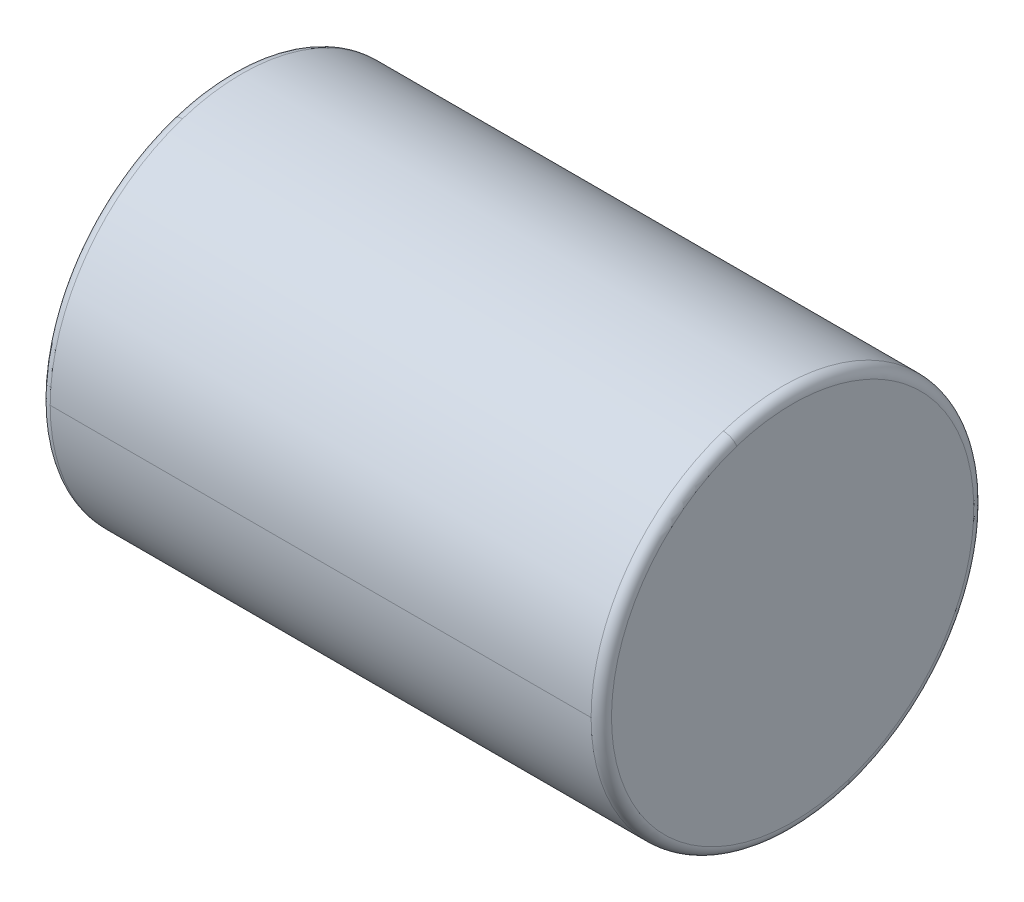
ISO-10303-21;
HEADER;
FILE_DESCRIPTION(('STEP AP214'),'2;1');
FILE_NAME('part.step','',(''),(''),'','','');
FILE_SCHEMA(('AUTOMOTIVE_DESIGN { 1 0 10303 214 1 1 1 1 }'));
ENDSEC;
DATA;
#1=APPLICATION_CONTEXT('core data for automotive mechanical design processes');
#2=APPLICATION_PROTOCOL_DEFINITION('international standard','automotive_design',2000,#1);
#3=PRODUCT_CONTEXT('',#1,'mechanical');
#4=PRODUCT('Part','Part','',(#3));
#5=PRODUCT_RELATED_PRODUCT_CATEGORY('part','',(#4));
#6=PRODUCT_DEFINITION_FORMATION('','',#4);
#7=PRODUCT_DEFINITION_CONTEXT('part definition',#1,'design');
#8=PRODUCT_DEFINITION('design','',#6,#7);
#9=PRODUCT_DEFINITION_SHAPE('','',#8);
#10=(LENGTH_UNIT() NAMED_UNIT(*) SI_UNIT(.MILLI.,.METRE.));
#11=(NAMED_UNIT(*) PLANE_ANGLE_UNIT() SI_UNIT($,.RADIAN.));
#12=(NAMED_UNIT(*) SI_UNIT($,.STERADIAN.) SOLID_ANGLE_UNIT());
#13=UNCERTAINTY_MEASURE_WITH_UNIT(LENGTH_MEASURE(1.E-05),#10,'distance_accuracy_value','');
#14=(GEOMETRIC_REPRESENTATION_CONTEXT(3) GLOBAL_UNCERTAINTY_ASSIGNED_CONTEXT((#13)) GLOBAL_UNIT_ASSIGNED_CONTEXT((#10,
#11,#12)) REPRESENTATION_CONTEXT('',''));
#15=CARTESIAN_POINT('',(0.,0.,0.));
#16=DIRECTION('',(0.,0.,1.));
#17=DIRECTION('',(1.,0.,0.));
#18=AXIS2_PLACEMENT_3D('',#15,#16,#17);
#19=CARTESIAN_POINT('',(3.5,19.5,0.));
#20=DIRECTION('',(1.,0.,0.));
#21=DIRECTION('',(0.,0.,-1.));
#22=AXIS2_PLACEMENT_3D('',#19,#20,#21);
#23=PLANE('',#22);
#24=CARTESIAN_POINT('',(3.5,22.8762506328473,1.0970103300309));
#25=CARTESIAN_POINT('',(3.5,22.8583019970289,1.15225453837415));
#26=CARTESIAN_POINT('',(3.5,22.8389952054567,1.20705734492169));
#27=CARTESIAN_POINT('',(3.5,22.7977168855232,1.31565005416887));
#28=CARTESIAN_POINT('',(3.5,22.7757453571619,1.36943995686851));
#29=CARTESIAN_POINT('',(3.5,22.7291891383688,1.47587675816336));
#30=CARTESIAN_POINT('',(3.5,22.7046044479369,1.52852365675857));
#31=CARTESIAN_POINT('',(3.5,22.6528814951799,1.63254775702777));
#32=CARTESIAN_POINT('',(3.5,22.6257432328547,1.68392495870174));
#33=CARTESIAN_POINT('',(3.5,22.5689784173612,1.78528585592611));
#34=CARTESIAN_POINT('',(3.5,22.5393518641929,1.8352695514765));
#35=CARTESIAN_POINT('',(3.5,22.4776818660732,1.93372303127344));
#36=CARTESIAN_POINT('',(3.5,22.4456384211218,1.98219281552));
#37=CARTESIAN_POINT('',(3.5,22.3792118279084,2.07750170209542));
#38=CARTESIAN_POINT('',(3.5,22.3448286796464,2.12434080442429));
#39=CARTESIAN_POINT('',(3.5,22.2738055137014,2.21627548837644));
#40=CARTESIAN_POINT('',(3.5,22.2371654960184,2.26137106999974));
#41=CARTESIAN_POINT('',(3.5,22.161716859741,2.34971007314386));
#42=CARTESIAN_POINT('',(3.5,22.1229082411468,2.3929534946647));
#43=CARTESIAN_POINT('',(3.5,22.0432158965429,2.47748400046493));
#44=CARTESIAN_POINT('',(3.5,22.0023321705334,2.51877108474432));
#45=CARTESIAN_POINT('',(3.5,21.9185881035399,2.59928945184562));
#46=CARTESIAN_POINT('',(3.5,21.875727762556,2.63852073466752));
#47=CARTESIAN_POINT('',(3.5,21.7881337199389,2.71483298726093));
#48=CARTESIAN_POINT('',(3.5,21.7434000183058,2.75191395703244));
#49=CARTESIAN_POINT('',(3.5,21.6521670217933,2.82383625221999));
#50=CARTESIAN_POINT('',(3.5,21.6056677269139,2.85867757763604));
#51=CARTESIAN_POINT('',(3.5,21.5110155647837,2.92603664830825));
#52=CARTESIAN_POINT('',(3.5,21.4628626975329,2.95855439356443));
#53=CARTESIAN_POINT('',(3.5,21.3650193951346,3.02118796582029));
#54=CARTESIAN_POINT('',(3.5,21.3153289599871,3.05130379281999));
#55=CARTESIAN_POINT('',(3.5,21.2145302304062,3.10906097689783));
#56=CARTESIAN_POINT('',(3.5,21.1634219359727,3.13670233397599));
#57=CARTESIAN_POINT('',(3.5,21.0599106121776,3.18944398776046));
#58=CARTESIAN_POINT('',(3.5,21.007507582816,3.21454428446677));
#59=CARTESIAN_POINT('',(3.5,20.9015330326522,3.26214334869426));
#60=CARTESIAN_POINT('',(3.5,20.8479615118501,3.28464211621544));
#61=CARTESIAN_POINT('',(3.5,20.7397790372914,3.32698392057105));
#62=CARTESIAN_POINT('',(3.5,20.6851680835348,3.34682695740548));
#63=CARTESIAN_POINT('',(3.5,20.575038305638,3.38380949677381));
#64=CARTESIAN_POINT('',(3.5,20.5195194814978,3.40094899930771));
#65=CARTESIAN_POINT('',(3.5,20.407707712544,3.43248317951214));
#66=CARTESIAN_POINT('',(3.5,20.3514147677304,3.44687785718266));
#67=CARTESIAN_POINT('',(3.5,20.2381903720647,3.472887709621));
#68=CARTESIAN_POINT('',(3.5,20.1812589212125,3.48450288438882));
#69=CARTESIAN_POINT('',(3.5,20.0668946663212,3.50492574904835));
#70=CARTESIAN_POINT('',(3.5,20.0094618622821,3.51373343894007));
#71=CARTESIAN_POINT('',(3.5,19.8942332616725,3.528520115351));
#72=CARTESIAN_POINT('',(3.5,19.836437465102,3.53449910187022));
#73=CARTESIAN_POINT('',(3.5,19.7206221145657,3.54361396763391));
#74=CARTESIAN_POINT('',(3.5,19.6626025605999,3.5467498468784));
#75=CARTESIAN_POINT('',(3.5,19.5464794694606,3.55017094348487));
#76=CARTESIAN_POINT('',(3.5,19.4883759322871,3.55045616084686));
#77=CARTESIAN_POINT('',(3.5,19.3722248512425,3.54817524657472));
#78=CARTESIAN_POINT('',(3.5,19.3141773073715,3.5456091149406));
#79=CARTESIAN_POINT('',(3.5,19.1982780545495,3.53763168471213));
#80=CARTESIAN_POINT('',(3.5,19.1404263455986,3.53222038611778));
#81=CARTESIAN_POINT('',(3.5,19.0250581324509,3.51856565826113));
#82=CARTESIAN_POINT('',(3.5,18.9675416282541,3.51032222899883));
#83=CARTESIAN_POINT('',(3.5,18.8529823869112,3.49102309894942));
#84=CARTESIAN_POINT('',(3.5,18.795939649765,3.47996739816231));
#85=CARTESIAN_POINT('',(3.5,18.6824653634734,3.45507035921483));
#86=CARTESIAN_POINT('',(3.5,18.626033814328,3.44122902105447));
#87=CARTESIAN_POINT('',(3.5,18.5139178525826,3.41079405235648));
#88=CARTESIAN_POINT('',(3.5,18.4582334399827,3.39420042181885));
#89=CARTESIAN_POINT('',(3.5,18.3477458999556,3.35830084387572));
#90=CARTESIAN_POINT('',(3.5,18.2929427725284,3.33899489647022));
#91=CARTESIAN_POINT('',(3.5,18.184349828381,3.29771719450965));
#92=CARTESIAN_POINT('',(3.5,18.1305600116608,3.27574543995458));
#93=CARTESIAN_POINT('',(3.5,18.0241232733073,3.2291890555761));
#94=CARTESIAN_POINT('',(3.5,17.971476351674,3.20460442575268));
#95=CARTESIAN_POINT('',(3.5,17.8674522345397,3.15288151736411));
#96=CARTESIAN_POINT('',(3.5,17.8160750390388,3.12574323879895));
#97=CARTESIAN_POINT('',(3.5,17.7147141463334,3.06897841141698));
#98=CARTESIAN_POINT('',(3.5,17.6647304491289,3.03935186260017));
#99=CARTESIAN_POINT('',(3.5,17.5662769681211,2.97768186766599));
#100=CARTESIAN_POINT('',(3.5,17.5178071843178,2.94563842154861));
#101=CARTESIAN_POINT('',(3.5,17.4224982980668,2.87921182748166));
#102=CARTESIAN_POINT('',(3.5,17.3756591956192,2.84482867953208));
#103=CARTESIAN_POINT('',(3.5,17.2837245115801,2.77380551381576));
#104=CARTESIAN_POINT('',(3.5,17.2386289299886,2.737165496049));
#105=CARTESIAN_POINT('',(3.5,17.1502899268678,2.6617168597104));
#106=CARTESIAN_POINT('',(3.5,17.1070465053384,2.62290824113856));
#107=CARTESIAN_POINT('',(3.5,17.022515999532,2.54321589655115));
#108=CARTESIAN_POINT('',(3.5,16.9812289152548,2.50233217053558));
#109=CARTESIAN_POINT('',(3.5,16.9007105481552,2.4185881035377));
#110=CARTESIAN_POINT('',(3.5,16.8614792653327,2.37572776255537));
#111=CARTESIAN_POINT('',(3.5,16.7851670127388,2.28813371993952));
#112=CARTESIAN_POINT('',(3.5,16.7480860429675,2.24340001830599));
#113=CARTESIAN_POINT('',(3.5,16.6761637477801,2.15216702179317));
#114=CARTESIAN_POINT('',(3.5,16.641322422364,2.10566772691388));
#115=CARTESIAN_POINT('',(3.5,16.5739633516917,2.01101556478375));
#116=CARTESIAN_POINT('',(3.5,16.5414456064356,1.96286269753292));
#117=CARTESIAN_POINT('',(3.5,16.4788120341797,1.86501939513461));
#118=CARTESIAN_POINT('',(3.5,16.44869620718,1.81532895998714));
#119=CARTESIAN_POINT('',(3.5,16.3909390231022,1.71453023040619));
#120=CARTESIAN_POINT('',(3.5,16.363297666024,1.66342193597271));
#121=CARTESIAN_POINT('',(3.5,16.3105560122395,1.5599106121776));
#122=CARTESIAN_POINT('',(3.5,16.2854557155332,1.50750758281597));
#123=CARTESIAN_POINT('',(3.5,16.2378566513057,1.40153303265224));
#124=CARTESIAN_POINT('',(3.5,16.2153578837845,1.34796151185015));
#125=CARTESIAN_POINT('',(3.5,16.173016079429,1.23977903729144));
#126=CARTESIAN_POINT('',(3.5,16.1531730425946,1.18516808353482));
#127=CARTESIAN_POINT('',(3.5,16.1161905032261,1.07503830563796));
#128=CARTESIAN_POINT('',(3.5,16.0990510006921,1.01951948149772));
#129=CARTESIAN_POINT('',(3.5,16.067516820488,0.907707712544036));
#130=CARTESIAN_POINT('',(3.5,16.0531221428179,0.851414767730596));
#131=CARTESIAN_POINT('',(3.5,16.0271122903784,0.738190372064524));
#132=CARTESIAN_POINT('',(3.5,16.0154971156089,0.681258921211892));
#133=CARTESIAN_POINT('',(3.5,15.9950742509539,0.566894666321858));
#134=CARTESIAN_POINT('',(3.5,15.9862665610684,0.509461862284455));
#135=CARTESIAN_POINT('',(3.5,15.9714798846405,0.394233261670217));
#136=CARTESIAN_POINT('',(3.5,15.9655008980981,0.336437465093383));
#137=CARTESIAN_POINT('',(3.5,15.9563860323977,0.220622114574256));
#138=CARTESIAN_POINT('',(3.5,15.9532501532397,0.162602560631964));
#139=CARTESIAN_POINT('',(3.5,15.9498290563971,0.0464794694285668));
#140=CARTESIAN_POINT('',(3.5,15.9495438387125,-0.011624067832539));
#141=CARTESIAN_POINT('',(3.5,15.9518247538659,-0.127775148637875));
#142=CARTESIAN_POINT('',(3.5,15.9543908867038,-0.185822692182105));
#143=CARTESIAN_POINT('',(3.5,15.9623683136434,-0.301721945896847));
#144=CARTESIAN_POINT('',(3.5,15.9677796077451,-0.35957365606736));
#145=CARTESIAN_POINT('',(3.5,15.981434347876,-0.474941865883132));
#146=CARTESIAN_POINT('',(3.5,15.9896777939051,-0.53245836552839));
#147=CARTESIAN_POINT('',(3.5,16.0089768781466,-0.647017619306336));
#148=CARTESIAN_POINT('',(3.5,16.020032516359,-0.704060373439023));
#149=CARTESIAN_POINT('',(3.5,16.0449297262638,-0.817534613322576));
#150=CARTESIAN_POINT('',(3.5,16.0587712979563,-0.873966099073442));
#151=CARTESIAN_POINT('',(3.5,16.0892056286328,-0.986082234015941));
#152=CARTESIAN_POINT('',(3.5,16.1057983876169,-1.04176688320757));
#153=CARTESIAN_POINT('',(3.5,16.1237493671527,-1.09701033003088));
#154=B_SPLINE_CURVE_WITH_KNOTS('',3,(#24,#25,#26,#27,#28,#29,#30,#31,#32,#33,#34,#35,#36,#37,
#38,#39,#40,#41,#42,#43,#44,#45,#46,#47,#48,#49,#50,#51,#52,#53,#54,#55,#56,#57,#58,#59,#60,#61,
#62,#63,#64,#65,#66,#67,#68,#69,#70,#71,#72,#73,#74,#75,#76,#77,#78,#79,#80,#81,#82,#83,#84,#85,
#86,#87,#88,#89,#90,#91,#92,#93,#94,#95,#96,#97,#98,#99,#100,#101,#102,#103,#104,#105,#106,#107,
#108,#109,#110,#111,#112,#113,#114,#115,#116,#117,#118,#119,#120,#121,#122,#123,#124,#125,#126,
#127,#128,#129,#130,#131,#132,#133,#134,#135,#136,#137,#138,#139,#140,#141,#142,#143,#144,#145,
#146,#147,#148,#149,#150,#151,#152,#153),.UNSPECIFIED.,.F.,.F.,(4,2,2,2,2,2,2,2,2,2,2,2,2,2,2,2,
2,2,2,2,2,2,2,2,2,2,2,2,2,2,2,2,2,2,2,2,2,2,2,2,2,2,2,2,2,2,2,2,2,2,2,2,2,2,2,2,2,2,2,2,2,2,2,2,
4),(0.,0.174242722512651,0.348485445025301,0.522728167537952,0.696970890050603,
0.871213612563252,1.0454563350759,1.21969905758855,1.3939417801012,1.56818450261386,
1.74242722512651,1.91666994763916,2.09091267015181,2.26515539266446,2.43939811517711,
2.61364083768976,2.78788356020241,2.96212628271506,3.13636900522771,3.31061172774036,
3.48485445025301,3.65909717276566,3.83333989527831,4.00758261779096,4.18182534030361,
4.35606806281626,4.53031078532891,4.70455350784156,4.87879623035421,5.05303895286687,
5.22728167537951,5.40152439789216,5.57576712040482,5.75000984291747,5.92425256543012,
6.09849528794276,6.27273801045542,6.44698073296807,6.62122345548072,6.79546617799337,
6.96970890050602,7.14395162301867,7.31819434553132,7.49243706804397,7.66667979055662,
7.84092251306927,8.01516523558192,8.18940795809457,8.36365068060722,8.53789340311987,
8.71213612563253,8.88637884814517,9.06062157065783,9.23486429317047,9.40910701568313,
9.58334973819577,9.75759246070843,9.93183518322108,10.1060779057337,10.2803206282464,
10.454563350759,10.6288060732717,10.8030487957843,10.977291518297,11.1515342408096),.UNSPECIFIED.);
#155=CARTESIAN_POINT('',(3.5,22.8762506328473,1.0970103300309));
#156=VERTEX_POINT('',#155);
#157=CARTESIAN_POINT('',(3.5,16.1237493671527,-1.0970103300309));
#158=VERTEX_POINT('',#157);
#159=EDGE_CURVE('E11',#156,#158,#154,.T.);
#160=ORIENTED_EDGE('',*,*,#159,.F.);
#161=CARTESIAN_POINT('',(3.5,16.1237493671527,-1.0970103300309));
#162=CARTESIAN_POINT('',(3.5,16.1416980029711,-1.15225453837415));
#163=CARTESIAN_POINT('',(3.5,16.1610047945433,-1.20705734492169));
#164=CARTESIAN_POINT('',(3.5,16.2022831144768,-1.31565005416887));
#165=CARTESIAN_POINT('',(3.5,16.2242546428381,-1.36943995686851));
#166=CARTESIAN_POINT('',(3.5,16.2708108616312,-1.47587675816336));
#167=CARTESIAN_POINT('',(3.5,16.2953955520631,-1.52852365675857));
#168=CARTESIAN_POINT('',(3.5,16.3471185048201,-1.63254775702777));
#169=CARTESIAN_POINT('',(3.5,16.3742567671453,-1.68392495870174));
#170=CARTESIAN_POINT('',(3.5,16.4310215826388,-1.78528585592611));
#171=CARTESIAN_POINT('',(3.5,16.4606481358071,-1.8352695514765));
#172=CARTESIAN_POINT('',(3.5,16.5223181339268,-1.93372303127344));
#173=CARTESIAN_POINT('',(3.5,16.5543615788782,-1.98219281552));
#174=CARTESIAN_POINT('',(3.5,16.6207881720916,-2.07750170209542));
#175=CARTESIAN_POINT('',(3.5,16.6551713203536,-2.12434080442429));
#176=CARTESIAN_POINT('',(3.5,16.7261944862986,-2.21627548837644));
#177=CARTESIAN_POINT('',(3.5,16.7628345039816,-2.26137106999973));
#178=CARTESIAN_POINT('',(3.5,16.838283140259,-2.34971007314386));
#179=CARTESIAN_POINT('',(3.5,16.8770917588532,-2.3929534946647));
#180=CARTESIAN_POINT('',(3.5,16.9567841034571,-2.47748400046493));
#181=CARTESIAN_POINT('',(3.5,16.9976678294666,-2.51877108474432));
#182=CARTESIAN_POINT('',(3.5,17.0814118964601,-2.59928945184562));
#183=CARTESIAN_POINT('',(3.5,17.124272237444,-2.63852073466752));
#184=CARTESIAN_POINT('',(3.5,17.2118662800611,-2.71483298726093));
#185=CARTESIAN_POINT('',(3.5,17.2565999816942,-2.75191395703244));
#186=CARTESIAN_POINT('',(3.5,17.3478329782067,-2.82383625221999));
#187=CARTESIAN_POINT('',(3.5,17.3943322730861,-2.85867757763604));
#188=CARTESIAN_POINT('',(3.5,17.4889844352163,-2.92603664830825));
#189=CARTESIAN_POINT('',(3.5,17.5371373024671,-2.95855439356443));
#190=CARTESIAN_POINT('',(3.5,17.6349806048654,-3.02118796582029));
#191=CARTESIAN_POINT('',(3.5,17.6846710400129,-3.05130379281999));
#192=CARTESIAN_POINT('',(3.5,17.7854697695938,-3.10906097689783));
#193=CARTESIAN_POINT('',(3.5,17.8365780640273,-3.13670233397599));
#194=CARTESIAN_POINT('',(3.5,17.9400893878224,-3.18944398776046));
#195=CARTESIAN_POINT('',(3.5,17.992492417184,-3.21454428446677));
#196=CARTESIAN_POINT('',(3.5,18.0984669673478,-3.26214334869426));
#197=CARTESIAN_POINT('',(3.5,18.1520384881499,-3.28464211621544));
#198=CARTESIAN_POINT('',(3.5,18.2602209627086,-3.32698392057105));
#199=CARTESIAN_POINT('',(3.5,18.3148319164652,-3.34682695740548));
#200=CARTESIAN_POINT('',(3.5,18.424961694362,-3.38380949677381));
#201=CARTESIAN_POINT('',(3.5,18.4804805185022,-3.40094899930771));
#202=CARTESIAN_POINT('',(3.5,18.592292287456,-3.43248317951214));
#203=CARTESIAN_POINT('',(3.5,18.6485852322696,-3.44687785718266));
#204=CARTESIAN_POINT('',(3.5,18.7618096279353,-3.472887709621));
#205=CARTESIAN_POINT('',(3.5,18.8187410787875,-3.48450288438881));
#206=CARTESIAN_POINT('',(3.5,18.9331053336788,-3.50492574904835));
#207=CARTESIAN_POINT('',(3.5,18.9905381377179,-3.51373343894007));
#208=CARTESIAN_POINT('',(3.5,19.1057667383275,-3.528520115351));
#209=CARTESIAN_POINT('',(3.5,19.163562534898,-3.53449910187022));
#210=CARTESIAN_POINT('',(3.5,19.2793778854343,-3.54361396763391));
#211=CARTESIAN_POINT('',(3.5,19.3373974394001,-3.5467498468784));
#212=CARTESIAN_POINT('',(3.5,19.4535205305394,-3.55017094348487));
#213=CARTESIAN_POINT('',(3.5,19.5116240677129,-3.55045616084686));
#214=CARTESIAN_POINT('',(3.5,19.6277751487575,-3.54817524657472));
#215=CARTESIAN_POINT('',(3.5,19.6858226926285,-3.5456091149406));
#216=CARTESIAN_POINT('',(3.5,19.8017219454505,-3.53763168471213));
#217=CARTESIAN_POINT('',(3.5,19.8595736544014,-3.53222038611778));
#218=CARTESIAN_POINT('',(3.5,19.9749418675491,-3.51856565826113));
#219=CARTESIAN_POINT('',(3.5,20.0324583717459,-3.51032222899883));
#220=CARTESIAN_POINT('',(3.5,20.1470176130888,-3.49102309894942));
#221=CARTESIAN_POINT('',(3.5,20.204060350235,-3.47996739816231));
#222=CARTESIAN_POINT('',(3.5,20.3175346365266,-3.45507035921483));
#223=CARTESIAN_POINT('',(3.5,20.373966185672,-3.44122902105447));
#224=CARTESIAN_POINT('',(3.5,20.4860821474174,-3.41079405235648));
#225=CARTESIAN_POINT('',(3.5,20.5417665600173,-3.39420042181885));
#226=CARTESIAN_POINT('',(3.5,20.6522541000444,-3.35830084387572));
#227=CARTESIAN_POINT('',(3.5,20.7070572274716,-3.33899489647022));
#228=CARTESIAN_POINT('',(3.5,20.815650171619,-3.29771719450965));
#229=CARTESIAN_POINT('',(3.5,20.8694399883392,-3.27574543995458));
#230=CARTESIAN_POINT('',(3.5,20.9758767266927,-3.2291890555761));
#231=CARTESIAN_POINT('',(3.5,21.028523648326,-3.20460442575268));
#232=CARTESIAN_POINT('',(3.5,21.1325477654603,-3.15288151736411));
#233=CARTESIAN_POINT('',(3.5,21.1839249609612,-3.12574323879895));
#234=CARTESIAN_POINT('',(3.5,21.2852858536666,-3.06897841141698));
#235=CARTESIAN_POINT('',(3.5,21.3352695508711,-3.03935186260017));
#236=CARTESIAN_POINT('',(3.5,21.4337230318789,-2.97768186766599));
#237=CARTESIAN_POINT('',(3.5,21.4821928156822,-2.94563842154861));
#238=CARTESIAN_POINT('',(3.5,21.5775017019332,-2.87921182748166));
#239=CARTESIAN_POINT('',(3.5,21.6243408043808,-2.84482867953209));
#240=CARTESIAN_POINT('',(3.5,21.7162754884199,-2.77380551381576));
#241=CARTESIAN_POINT('',(3.5,21.7613710700114,-2.73716549604901));
#242=CARTESIAN_POINT('',(3.5,21.8497100731322,-2.66171685971041));
#243=CARTESIAN_POINT('',(3.5,21.8929534946616,-2.62290824113856));
#244=CARTESIAN_POINT('',(3.5,21.977484000468,-2.54321589655115));
#245=CARTESIAN_POINT('',(3.5,22.0187710847451,-2.50233217053559));
#246=CARTESIAN_POINT('',(3.5,22.0992894518448,-2.4185881035377));
#247=CARTESIAN_POINT('',(3.5,22.1385207346673,-2.37572776255538));
#248=CARTESIAN_POINT('',(3.5,22.2148329872611,-2.28813371993953));
#249=CARTESIAN_POINT('',(3.5,22.2519139570325,-2.243400018306));
#250=CARTESIAN_POINT('',(3.5,22.3238362522199,-2.15216702179318));
#251=CARTESIAN_POINT('',(3.5,22.358677577636,-2.10566772691389));
#252=CARTESIAN_POINT('',(3.5,22.4260366483083,-2.01101556478376));
#253=CARTESIAN_POINT('',(3.5,22.4585543935644,-1.96286269753293));
#254=CARTESIAN_POINT('',(3.5,22.5211879658203,-1.86501939513462));
#255=CARTESIAN_POINT('',(3.5,22.55130379282,-1.81532895998714));
#256=CARTESIAN_POINT('',(3.5,22.6090609768978,-1.71453023040619));
#257=CARTESIAN_POINT('',(3.5,22.636702333976,-1.66342193597271));
#258=CARTESIAN_POINT('',(3.5,22.6894439877604,-1.5599106121776));
#259=CARTESIAN_POINT('',(3.5,22.7145442844668,-1.50750758281597));
#260=CARTESIAN_POINT('',(3.5,22.7621433486943,-1.40153303265225));
#261=CARTESIAN_POINT('',(3.5,22.7846421162155,-1.34796151185015));
#262=CARTESIAN_POINT('',(3.5,22.826983920571,-1.23977903729144));
#263=CARTESIAN_POINT('',(3.5,22.8468269574054,-1.18516808353482));
#264=CARTESIAN_POINT('',(3.5,22.8838094967739,-1.07503830563796));
#265=CARTESIAN_POINT('',(3.5,22.9009489993079,-1.01951948149772));
#266=CARTESIAN_POINT('',(3.5,22.932483179512,-0.907707712544041));
#267=CARTESIAN_POINT('',(3.5,22.9468778571821,-0.851414767730601));
#268=CARTESIAN_POINT('',(3.5,22.9728877096216,-0.738190372064529));
#269=CARTESIAN_POINT('',(3.5,22.9845028843911,-0.681258921211897));
#270=CARTESIAN_POINT('',(3.5,23.0049257490461,-0.566894666321863));
#271=CARTESIAN_POINT('',(3.5,23.0137334389316,-0.50946186228446));
#272=CARTESIAN_POINT('',(3.5,23.0285201153595,-0.394233261670222));
#273=CARTESIAN_POINT('',(3.5,23.0344991019019,-0.336437465093388));
#274=CARTESIAN_POINT('',(3.5,23.0436139676023,-0.220622114574263));
#275=CARTESIAN_POINT('',(3.5,23.0467498467603,-0.162602560631971));
#276=CARTESIAN_POINT('',(3.5,23.0501709436029,-0.0464794694285737));
#277=CARTESIAN_POINT('',(3.5,23.0504561612875,0.0116240678325322));
#278=CARTESIAN_POINT('',(3.5,23.0481752461341,0.127775148637868));
#279=CARTESIAN_POINT('',(3.5,23.0456091132962,0.185822692182098));
#280=CARTESIAN_POINT('',(3.5,23.0376316863566,0.301721945896841));
#281=CARTESIAN_POINT('',(3.5,23.0322203922549,0.359573656067354));
#282=CARTESIAN_POINT('',(3.5,23.018565652124,0.474941865883126));
#283=CARTESIAN_POINT('',(3.5,23.0103222060949,0.532458365528386));
#284=CARTESIAN_POINT('',(3.5,22.9910231218534,0.647017619306332));
#285=CARTESIAN_POINT('',(3.5,22.979967483641,0.704060373439019));
#286=CARTESIAN_POINT('',(3.5,22.9550702737362,0.817534613322572));
#287=CARTESIAN_POINT('',(3.5,22.9412287020437,0.873966099073438));
#288=CARTESIAN_POINT('',(3.5,22.9107943713672,0.986082234015937));
#289=CARTESIAN_POINT('',(3.5,22.8942016123831,1.04176688320757));
#290=CARTESIAN_POINT('',(3.5,22.8762506328473,1.09701033003088));
#291=B_SPLINE_CURVE_WITH_KNOTS('',3,(#161,#162,#163,#164,#165,#166,#167,#168,#169,#170,#171,
#172,#173,#174,#175,#176,#177,#178,#179,#180,#181,#182,#183,#184,#185,#186,#187,#188,#189,#190,
#191,#192,#193,#194,#195,#196,#197,#198,#199,#200,#201,#202,#203,#204,#205,#206,#207,#208,#209,
#210,#211,#212,#213,#214,#215,#216,#217,#218,#219,#220,#221,#222,#223,#224,#225,#226,#227,#228,
#229,#230,#231,#232,#233,#234,#235,#236,#237,#238,#239,#240,#241,#242,#243,#244,#245,#246,#247,
#248,#249,#250,#251,#252,#253,#254,#255,#256,#257,#258,#259,#260,#261,#262,#263,#264,#265,#266,
#267,#268,#269,#270,#271,#272,#273,#274,#275,#276,#277,#278,#279,#280,#281,#282,#283,#284,#285,
#286,#287,#288,#289,#290),.UNSPECIFIED.,.F.,.F.,(4,2,2,2,2,2,2,2,2,2,2,2,2,2,2,2,2,2,2,2,2,2,2,
2,2,2,2,2,2,2,2,2,2,2,2,2,2,2,2,2,2,2,2,2,2,2,2,2,2,2,2,2,2,2,2,2,2,2,2,2,2,2,2,2,4),(0.,
0.174242722512651,0.3484854450253,0.522728167537951,0.696970890050602,0.871213612563252,
1.0454563350759,1.21969905758855,1.3939417801012,1.56818450261385,1.74242722512651,
1.91666994763915,2.09091267015181,2.26515539266446,2.4393981151771,2.61364083768975,
2.78788356020241,2.96212628271506,3.13636900522771,3.31061172774036,3.48485445025301,
3.65909717276566,3.83333989527831,4.00758261779096,4.18182534030361,4.35606806281626,
4.53031078532891,4.70455350784156,4.87879623035421,5.05303895286686,5.22728167537951,
5.40152439789216,5.57576712040481,5.75000984291746,5.92425256543011,6.09849528794277,
6.27273801045541,6.44698073296807,6.62122345548072,6.79546617799337,6.96970890050602,
7.14395162301866,7.31819434553132,7.49243706804397,7.66667979055662,7.84092251306927,
8.01516523558192,8.18940795809457,8.36365068060722,8.53789340311987,8.71213612563252,
8.88637884814517,9.06062157065782,9.23486429317047,9.40910701568312,9.58334973819577,
9.75759246070842,9.93183518322107,10.1060779057337,10.2803206282464,10.454563350759,
10.6288060732717,10.8030487957843,10.977291518297,11.1515342408096),.UNSPECIFIED.);
#292=EDGE_CURVE('E26',#158,#156,#291,.T.);
#293=ORIENTED_EDGE('',*,*,#292,.F.);
#294=EDGE_LOOP('',(#160,#293));
#295=FACE_BOUND('',#294,.T.);
#296=ADVANCED_FACE('F17',(#295),#23,.F.);
#297=CARTESIAN_POINT('',(3.70000000000054,19.5,0.));
#298=DIRECTION('',(1.,0.,0.));
#299=DIRECTION('',(0.,-0.309016994374947,0.951056516295154));
#300=AXIS2_PLACEMENT_3D('',#297,#298,#299);
#301=TOROIDAL_SURFACE('',#300,3.54999999999946,0.200000000000541);
#302=CARTESIAN_POINT('',(3.70000000000054,16.1237493671527,-1.0970103300309));
#303=DIRECTION('',(0.,0.309016994374947,-0.951056516295154));
#304=DIRECTION('',(-2.70228284193032E-12,-0.951056516295154,-0.309016994374947));
#305=AXIS2_PLACEMENT_3D('',#302,#303,#304);
#306=CIRCLE('',#305,0.200000000000541);
#307=CARTESIAN_POINT('',(3.7,15.9335380638932,-1.15881372890605));
#308=VERTEX_POINT('',#307);
#309=EDGE_CURVE('E139',#308,#158,#306,.T.);
#310=ORIENTED_EDGE('',*,*,#309,.T.);
#311=ORIENTED_EDGE('',*,*,#292,.T.);
#312=CARTESIAN_POINT('',(3.70000000000054,22.8762506328473,1.0970103300309));
#313=DIRECTION('',(0.,-0.309016994374947,0.951056516295154));
#314=DIRECTION('',(-2.70228284193032E-12,0.951056516295154,0.309016994374947));
#315=AXIS2_PLACEMENT_3D('',#312,#313,#314);
#316=CIRCLE('',#315,0.200000000000541);
#317=CARTESIAN_POINT('',(3.7,23.0664619361068,1.15881372890605));
#318=VERTEX_POINT('',#317);
#319=EDGE_CURVE('E135',#318,#156,#316,.T.);
#320=ORIENTED_EDGE('',*,*,#319,.F.);
#321=CARTESIAN_POINT('',(3.7,19.5,0.));
#322=DIRECTION('',(1.,0.,0.));
#323=DIRECTION('',(0.,0.,-1.));
#324=AXIS2_PLACEMENT_3D('',#321,#322,#323);
#325=CIRCLE('',#324,3.75);
#326=CARTESIAN_POINT('',(3.7,19.5,-3.75));
#327=VERTEX_POINT('',#326);
#328=EDGE_CURVE('E130',#327,#318,#325,.T.);
#329=ORIENTED_EDGE('',*,*,#328,.F.);
#330=CARTESIAN_POINT('',(3.7,19.5,0.));
#331=DIRECTION('',(1.,0.,0.));
#332=DIRECTION('',(0.,0.,-1.));
#333=AXIS2_PLACEMENT_3D('',#330,#331,#332);
#334=CIRCLE('',#333,3.75);
#335=EDGE_CURVE('E125',#308,#327,#334,.T.);
#336=ORIENTED_EDGE('',*,*,#335,.F.);
#337=EDGE_LOOP('',(#310,#311,#320,#329,#336));
#338=FACE_BOUND('',#337,.T.);
#339=ADVANCED_FACE('F146',(#338),#301,.T.);
#340=CARTESIAN_POINT('',(14.5,19.5,0.));
#341=DIRECTION('',(1.,0.,0.));
#342=DIRECTION('',(0.,1.,0.));
#343=AXIS2_PLACEMENT_3D('',#340,#341,#342);
#344=CYLINDRICAL_SURFACE('',#343,3.75);
#345=DIRECTION('',(1.,0.,0.));
#346=VECTOR('',#345,1.);
#347=CARTESIAN_POINT('',(3.7,19.5,3.75));
#348=LINE('',#347,#346);
#349=CARTESIAN_POINT('',(3.7,19.5,3.75));
#350=VERTEX_POINT('',#349);
#351=CARTESIAN_POINT('',(14.3,19.5,3.75));
#352=VERTEX_POINT('',#351);
#353=EDGE_CURVE('E92',#350,#352,#348,.T.);
#354=ORIENTED_EDGE('',*,*,#353,.F.);
#355=CARTESIAN_POINT('',(3.7,19.5,0.));
#356=DIRECTION('',(1.,0.,0.));
#357=DIRECTION('',(0.,0.,-1.));
#358=AXIS2_PLACEMENT_3D('',#355,#356,#357);
#359=CIRCLE('',#358,3.75);
#360=EDGE_CURVE('E117',#350,#308,#359,.T.);
#361=ORIENTED_EDGE('',*,*,#360,.T.);
#362=ORIENTED_EDGE('',*,*,#335,.T.);
#363=DIRECTION('',(1.,0.,0.));
#364=VECTOR('',#363,1.);
#365=CARTESIAN_POINT('',(3.7,19.5,-3.75));
#366=LINE('',#365,#364);
#367=CARTESIAN_POINT('',(14.3,19.5,-3.75));
#368=VERTEX_POINT('',#367);
#369=EDGE_CURVE('E113',#327,#368,#366,.T.);
#370=ORIENTED_EDGE('',*,*,#369,.T.);
#371=CARTESIAN_POINT('',(14.3,19.5,0.));
#372=DIRECTION('',(1.,0.,0.));
#373=DIRECTION('',(0.,0.,-1.));
#374=AXIS2_PLACEMENT_3D('',#371,#372,#373);
#375=CIRCLE('',#374,3.75);
#376=CARTESIAN_POINT('',(14.3,15.9335380638932,-1.15881372890605));
#377=VERTEX_POINT('',#376);
#378=EDGE_CURVE('E84',#377,#368,#375,.T.);
#379=ORIENTED_EDGE('',*,*,#378,.F.);
#380=CARTESIAN_POINT('',(14.3,19.5,0.));
#381=DIRECTION('',(1.,0.,0.));
#382=DIRECTION('',(0.,0.,-1.));
#383=AXIS2_PLACEMENT_3D('',#380,#381,#382);
#384=CIRCLE('',#383,3.75);
#385=EDGE_CURVE('E106',#352,#377,#384,.T.);
#386=ORIENTED_EDGE('',*,*,#385,.F.);
#387=EDGE_LOOP('',(#354,#361,#362,#370,#379,#386));
#388=FACE_BOUND('',#387,.T.);
#389=ADVANCED_FACE('F155',(#388),#344,.T.);
#390=CARTESIAN_POINT('',(14.2999999999989,19.5,0.));
#391=DIRECTION('',(1.,0.,0.));
#392=DIRECTION('',(0.,0.309016994374947,-0.951056516295154));
#393=AXIS2_PLACEMENT_3D('',#390,#391,#392);
#394=TOROIDAL_SURFACE('',#393,3.54999999999895,0.20000000000105);
#395=CARTESIAN_POINT('',(14.2999999999989,16.1237493671532,-1.09701033003074));
#396=DIRECTION('',(0.,0.309016994374947,-0.951056516295154));
#397=DIRECTION('',(1.,0.,0.));
#398=AXIS2_PLACEMENT_3D('',#395,#396,#397);
#399=CIRCLE('',#398,0.200000000001049);
#400=CARTESIAN_POINT('',(14.5,16.1237493671532,-1.09701033003074));
#401=VERTEX_POINT('',#400);
#402=EDGE_CURVE('E102',#401,#377,#399,.T.);
#403=ORIENTED_EDGE('',*,*,#402,.F.);
#404=CARTESIAN_POINT('',(14.5,19.5,0.));
#405=DIRECTION('',(1.,0.,0.));
#406=DIRECTION('',(0.,0.,-1.));
#407=AXIS2_PLACEMENT_3D('',#404,#405,#406);
#408=CIRCLE('',#407,3.55);
#409=CARTESIAN_POINT('',(14.5,22.8762506328468,1.09701033003074));
#410=VERTEX_POINT('',#409);
#411=EDGE_CURVE('E74',#410,#401,#408,.T.);
#412=ORIENTED_EDGE('',*,*,#411,.F.);
#413=CARTESIAN_POINT('',(14.2999999999989,22.8762506328468,1.09701033003074));
#414=DIRECTION('',(0.,-0.309016994374947,0.951056516295154));
#415=DIRECTION('',(1.,0.,0.));
#416=AXIS2_PLACEMENT_3D('',#413,#414,#415);
#417=CIRCLE('',#416,0.200000000001049);
#418=CARTESIAN_POINT('',(14.3,23.0664619361068,1.15881372890605));
#419=VERTEX_POINT('',#418);
#420=EDGE_CURVE('E67',#410,#419,#417,.T.);
#421=ORIENTED_EDGE('',*,*,#420,.T.);
#422=CARTESIAN_POINT('',(14.3,19.5,0.));
#423=DIRECTION('',(1.,0.,0.));
#424=DIRECTION('',(0.,0.,-1.));
#425=AXIS2_PLACEMENT_3D('',#422,#423,#424);
#426=CIRCLE('',#425,3.75);
#427=EDGE_CURVE('E72',#419,#352,#426,.T.);
#428=ORIENTED_EDGE('',*,*,#427,.T.);
#429=ORIENTED_EDGE('',*,*,#385,.T.);
#430=EDGE_LOOP('',(#403,#412,#421,#428,#429));
#431=FACE_BOUND('',#430,.T.);
#432=ADVANCED_FACE('F69',(#431),#394,.T.);
#433=CARTESIAN_POINT('',(14.5,19.5,0.));
#434=DIRECTION('',(1.,0.,0.));
#435=DIRECTION('',(0.,-1.,0.));
#436=AXIS2_PLACEMENT_3D('',#433,#434,#435);
#437=CYLINDRICAL_SURFACE('',#436,3.75);
#438=ORIENTED_EDGE('',*,*,#353,.T.);
#439=ORIENTED_EDGE('',*,*,#427,.F.);
#440=CARTESIAN_POINT('',(14.3,19.5,0.));
#441=DIRECTION('',(1.,0.,0.));
#442=DIRECTION('',(0.,0.,-1.));
#443=AXIS2_PLACEMENT_3D('',#440,#441,#442);
#444=CIRCLE('',#443,3.75);
#445=EDGE_CURVE('E81',#368,#419,#444,.T.);
#446=ORIENTED_EDGE('',*,*,#445,.F.);
#447=ORIENTED_EDGE('',*,*,#369,.F.);
#448=ORIENTED_EDGE('',*,*,#328,.T.);
#449=CARTESIAN_POINT('',(3.7,19.5,0.));
#450=DIRECTION('',(1.,0.,0.));
#451=DIRECTION('',(0.,0.,-1.));
#452=AXIS2_PLACEMENT_3D('',#449,#450,#451);
#453=CIRCLE('',#452,3.75);
#454=EDGE_CURVE('E87',#318,#350,#453,.T.);
#455=ORIENTED_EDGE('',*,*,#454,.T.);
#456=EDGE_LOOP('',(#438,#439,#446,#447,#448,#455));
#457=FACE_BOUND('',#456,.T.);
#458=ADVANCED_FACE('F90',(#457),#437,.T.);
#459=CARTESIAN_POINT('',(3.70000000000054,19.5,0.));
#460=DIRECTION('',(1.,0.,0.));
#461=DIRECTION('',(0.,0.309016994374947,-0.951056516295154));
#462=AXIS2_PLACEMENT_3D('',#459,#460,#461);
#463=TOROIDAL_SURFACE('',#462,3.54999999999946,0.200000000000541);
#464=ORIENTED_EDGE('',*,*,#309,.F.);
#465=ORIENTED_EDGE('',*,*,#360,.F.);
#466=ORIENTED_EDGE('',*,*,#454,.F.);
#467=ORIENTED_EDGE('',*,*,#319,.T.);
#468=ORIENTED_EDGE('',*,*,#159,.T.);
#469=EDGE_LOOP('',(#464,#465,#466,#467,#468));
#470=FACE_BOUND('',#469,.T.);
#471=ADVANCED_FACE('F164',(#470),#463,.T.);
#472=CARTESIAN_POINT('',(14.2999999999989,19.5,0.));
#473=DIRECTION('',(1.,0.,0.));
#474=DIRECTION('',(0.,-0.309016994374947,0.951056516295154));
#475=AXIS2_PLACEMENT_3D('',#472,#473,#474);
#476=TOROIDAL_SURFACE('',#475,3.54999999999895,0.20000000000105);
#477=ORIENTED_EDGE('',*,*,#402,.T.);
#478=ORIENTED_EDGE('',*,*,#378,.T.);
#479=ORIENTED_EDGE('',*,*,#445,.T.);
#480=ORIENTED_EDGE('',*,*,#420,.F.);
#481=CARTESIAN_POINT('',(14.5,16.1237493671522,-1.09701033003106));
#482=CARTESIAN_POINT('',(14.5,16.4687083586184,-2.1572190815559));
#483=CARTESIAN_POINT('',(14.5,17.2281507562175,-3.08499449048546));
#484=CARTESIAN_POINT('',(14.5,18.3401929963209,-3.65016544654377));
#485=CARTESIAN_POINT('',(14.5,20.7320156648629,-3.79175432929068));
#486=CARTESIAN_POINT('',(14.5,22.5838169940774,-2.27132842626606));
#487=CARTESIAN_POINT('',(14.5,23.1512789117888,-1.16045348942864));
#488=CARTESIAN_POINT('',(14.5,23.2203480148869,0.0365216246328819));
#489=CARTESIAN_POINT('',(14.5,22.8762506328478,1.09701033003106));
#490=B_SPLINE_CURVE_WITH_KNOTS('',5,(#481,#482,#483,#484,#485,#486,#487,#488,#489),
.UNSPECIFIED.,.F.,.F.,(6,3,6),(0.,1.5707963267949,3.14159265358979),.UNSPECIFIED.);
#491=EDGE_CURVE('E185',#401,#410,#490,.T.);
#492=ORIENTED_EDGE('',*,*,#491,.F.);
#493=EDGE_LOOP('',(#477,#478,#479,#480,#492));
#494=FACE_BOUND('',#493,.T.);
#495=ADVANCED_FACE('F83',(#494),#476,.T.);
#496=CARTESIAN_POINT('',(14.5,23.05,0.));
#497=DIRECTION('',(-1.,0.,0.));
#498=DIRECTION('',(0.,0.,1.));
#499=AXIS2_PLACEMENT_3D('',#496,#497,#498);
#500=PLANE('',#499);
#501=ORIENTED_EDGE('',*,*,#491,.T.);
#502=ORIENTED_EDGE('',*,*,#411,.T.);
#503=EDGE_LOOP('',(#501,#502));
#504=FACE_BOUND('',#503,.T.);
#505=ADVANCED_FACE('F191',(#504),#500,.F.);
#506=CLOSED_SHELL('',(#296,#339,#389,#432,#458,#471,#495,#505));
#507=MANIFOLD_SOLID_BREP('B1',#506);
#508=ADVANCED_BREP_SHAPE_REPRESENTATION('',(#18,#507),#14);
#509=SHAPE_DEFINITION_REPRESENTATION(#9,#508);
ENDSEC;
END-ISO-10303-21;
